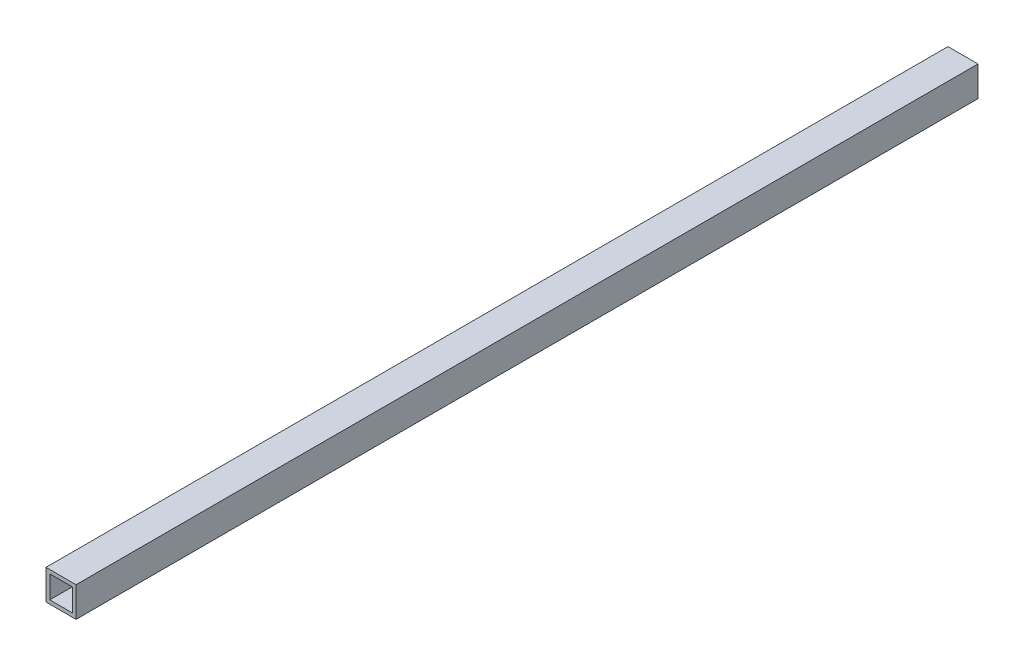
ISO-10303-21;
HEADER;
FILE_DESCRIPTION(('STEP AP214'),'2;1');
FILE_NAME('part.step','',(''),(''),'','','');
FILE_SCHEMA(('AUTOMOTIVE_DESIGN { 1 0 10303 214 1 1 1 1 }'));
ENDSEC;
DATA;
#1=APPLICATION_CONTEXT('core data for automotive mechanical design processes');
#2=APPLICATION_PROTOCOL_DEFINITION('international standard','automotive_design',2000,#1);
#3=PRODUCT_CONTEXT('',#1,'mechanical');
#4=PRODUCT('Part','Part','',(#3));
#5=PRODUCT_RELATED_PRODUCT_CATEGORY('part','',(#4));
#6=PRODUCT_DEFINITION_FORMATION('','',#4);
#7=PRODUCT_DEFINITION_CONTEXT('part definition',#1,'design');
#8=PRODUCT_DEFINITION('design','',#6,#7);
#9=PRODUCT_DEFINITION_SHAPE('','',#8);
#10=(LENGTH_UNIT() NAMED_UNIT(*) SI_UNIT(.MILLI.,.METRE.));
#11=(NAMED_UNIT(*) PLANE_ANGLE_UNIT() SI_UNIT($,.RADIAN.));
#12=(NAMED_UNIT(*) SI_UNIT($,.STERADIAN.) SOLID_ANGLE_UNIT());
#13=UNCERTAINTY_MEASURE_WITH_UNIT(LENGTH_MEASURE(1.E-05),#10,'distance_accuracy_value','');
#14=(GEOMETRIC_REPRESENTATION_CONTEXT(3) GLOBAL_UNCERTAINTY_ASSIGNED_CONTEXT((#13)) GLOBAL_UNIT_ASSIGNED_CONTEXT((#10,
#11,#12)) REPRESENTATION_CONTEXT('',''));
#15=CARTESIAN_POINT('',(0.,0.,0.));
#16=DIRECTION('',(0.,0.,1.));
#17=DIRECTION('',(1.,0.,0.));
#18=AXIS2_PLACEMENT_3D('',#15,#16,#17);
#19=CARTESIAN_POINT('',(0.,0.,762.));
#20=DIRECTION('',(0.,0.,-1.));
#21=DIRECTION('',(-1.,0.,0.));
#22=AXIS2_PLACEMENT_3D('',#19,#20,#21);
#23=PLANE('',#22);
#24=DIRECTION('',(0.,-1.,0.));
#25=VECTOR('',#24,1.);
#26=CARTESIAN_POINT('',(0.,0.,762.));
#27=LINE('',#26,#25);
#28=CARTESIAN_POINT('',(0.,25.4,762.));
#29=VERTEX_POINT('',#28);
#30=CARTESIAN_POINT('',(0.,0.,762.));
#31=VERTEX_POINT('',#30);
#32=EDGE_CURVE('E138',#29,#31,#27,.T.);
#33=ORIENTED_EDGE('',*,*,#32,.T.);
#34=DIRECTION('',(1.,0.,0.));
#35=VECTOR('',#34,1.);
#36=CARTESIAN_POINT('',(0.,0.,762.));
#37=LINE('',#36,#35);
#38=CARTESIAN_POINT('',(25.4,0.,762.));
#39=VERTEX_POINT('',#38);
#40=EDGE_CURVE('E141',#31,#39,#37,.T.);
#41=ORIENTED_EDGE('',*,*,#40,.T.);
#42=DIRECTION('',(0.,1.,0.));
#43=VECTOR('',#42,1.);
#44=CARTESIAN_POINT('',(25.4,0.,762.));
#45=LINE('',#44,#43);
#46=CARTESIAN_POINT('',(25.4,25.4,762.));
#47=VERTEX_POINT('',#46);
#48=EDGE_CURVE('E144',#39,#47,#45,.T.);
#49=ORIENTED_EDGE('',*,*,#48,.T.);
#50=DIRECTION('',(-1.,0.,0.));
#51=VECTOR('',#50,1.);
#52=CARTESIAN_POINT('',(0.,25.4,762.));
#53=LINE('',#52,#51);
#54=EDGE_CURVE('E146',#47,#29,#53,.T.);
#55=ORIENTED_EDGE('',*,*,#54,.T.);
#56=EDGE_LOOP('',(#33,#41,#49,#55));
#57=FACE_BOUND('',#56,.T.);
#58=DIRECTION('',(0.,-1.,0.));
#59=VECTOR('',#58,1.);
#60=CARTESIAN_POINT('',(3.175,3.175,762.));
#61=LINE('',#60,#59);
#62=CARTESIAN_POINT('',(3.175,22.225,762.));
#63=VERTEX_POINT('',#62);
#64=CARTESIAN_POINT('',(3.175,3.175,762.));
#65=VERTEX_POINT('',#64);
#66=EDGE_CURVE('E102',#63,#65,#61,.T.);
#67=ORIENTED_EDGE('',*,*,#66,.F.);
#68=DIRECTION('',(-1.,0.,0.));
#69=VECTOR('',#68,1.);
#70=CARTESIAN_POINT('',(3.175,22.225,762.));
#71=LINE('',#70,#69);
#72=CARTESIAN_POINT('',(22.225,22.225,762.));
#73=VERTEX_POINT('',#72);
#74=EDGE_CURVE('E124',#73,#63,#71,.T.);
#75=ORIENTED_EDGE('',*,*,#74,.F.);
#76=DIRECTION('',(0.,1.,0.));
#77=VECTOR('',#76,1.);
#78=CARTESIAN_POINT('',(22.225,3.175,762.));
#79=LINE('',#78,#77);
#80=CARTESIAN_POINT('',(22.225,3.175,762.));
#81=VERTEX_POINT('',#80);
#82=EDGE_CURVE('E122',#81,#73,#79,.T.);
#83=ORIENTED_EDGE('',*,*,#82,.F.);
#84=DIRECTION('',(1.,0.,0.));
#85=VECTOR('',#84,1.);
#86=CARTESIAN_POINT('',(3.175,3.175,762.));
#87=LINE('',#86,#85);
#88=EDGE_CURVE('E110',#65,#81,#87,.T.);
#89=ORIENTED_EDGE('',*,*,#88,.F.);
#90=EDGE_LOOP('',(#67,#75,#83,#89));
#91=FACE_BOUND('',#90,.T.);
#92=ADVANCED_FACE('F37',(#57,#91),#23,.F.);
#93=CARTESIAN_POINT('',(0.,0.,0.));
#94=DIRECTION('',(0.,0.,-1.));
#95=DIRECTION('',(-1.,0.,0.));
#96=AXIS2_PLACEMENT_3D('',#93,#94,#95);
#97=PLANE('',#96);
#98=DIRECTION('',(0.,-1.,0.));
#99=VECTOR('',#98,1.);
#100=CARTESIAN_POINT('',(0.,0.,0.));
#101=LINE('',#100,#99);
#102=CARTESIAN_POINT('',(0.,25.4,0.));
#103=VERTEX_POINT('',#102);
#104=CARTESIAN_POINT('',(0.,0.,0.));
#105=VERTEX_POINT('',#104);
#106=EDGE_CURVE('E118',#103,#105,#101,.T.);
#107=ORIENTED_EDGE('',*,*,#106,.F.);
#108=DIRECTION('',(-1.,0.,0.));
#109=VECTOR('',#108,1.);
#110=CARTESIAN_POINT('',(0.,25.4,0.));
#111=LINE('',#110,#109);
#112=CARTESIAN_POINT('',(25.4,25.4,0.));
#113=VERTEX_POINT('',#112);
#114=EDGE_CURVE('E142',#113,#103,#111,.T.);
#115=ORIENTED_EDGE('',*,*,#114,.F.);
#116=DIRECTION('',(0.,1.,0.));
#117=VECTOR('',#116,1.);
#118=CARTESIAN_POINT('',(25.4,0.,0.));
#119=LINE('',#118,#117);
#120=CARTESIAN_POINT('',(25.4,0.,0.));
#121=VERTEX_POINT('',#120);
#122=EDGE_CURVE('E153',#121,#113,#119,.T.);
#123=ORIENTED_EDGE('',*,*,#122,.F.);
#124=DIRECTION('',(1.,0.,0.));
#125=VECTOR('',#124,1.);
#126=CARTESIAN_POINT('',(0.,0.,0.));
#127=LINE('',#126,#125);
#128=EDGE_CURVE('E151',#105,#121,#127,.T.);
#129=ORIENTED_EDGE('',*,*,#128,.F.);
#130=EDGE_LOOP('',(#107,#115,#123,#129));
#131=FACE_BOUND('',#130,.T.);
#132=DIRECTION('',(-1.,0.,0.));
#133=VECTOR('',#132,1.);
#134=CARTESIAN_POINT('',(3.175,22.225,0.));
#135=LINE('',#134,#133);
#136=CARTESIAN_POINT('',(22.225,22.225,0.));
#137=VERTEX_POINT('',#136);
#138=CARTESIAN_POINT('',(3.175,22.225,0.));
#139=VERTEX_POINT('',#138);
#140=EDGE_CURVE('E111',#137,#139,#135,.T.);
#141=ORIENTED_EDGE('',*,*,#140,.T.);
#142=DIRECTION('',(0.,-1.,0.));
#143=VECTOR('',#142,1.);
#144=CARTESIAN_POINT('',(3.175,3.175,0.));
#145=LINE('',#144,#143);
#146=CARTESIAN_POINT('',(3.175,3.175,0.));
#147=VERTEX_POINT('',#146);
#148=EDGE_CURVE('E60',#139,#147,#145,.T.);
#149=ORIENTED_EDGE('',*,*,#148,.T.);
#150=DIRECTION('',(1.,0.,0.));
#151=VECTOR('',#150,1.);
#152=CARTESIAN_POINT('',(3.175,3.175,0.));
#153=LINE('',#152,#151);
#154=CARTESIAN_POINT('',(22.225,3.175,0.));
#155=VERTEX_POINT('',#154);
#156=EDGE_CURVE('E117',#147,#155,#153,.T.);
#157=ORIENTED_EDGE('',*,*,#156,.T.);
#158=DIRECTION('',(0.,1.,0.));
#159=VECTOR('',#158,1.);
#160=CARTESIAN_POINT('',(22.225,3.175,0.));
#161=LINE('',#160,#159);
#162=EDGE_CURVE('E130',#155,#137,#161,.T.);
#163=ORIENTED_EDGE('',*,*,#162,.T.);
#164=EDGE_LOOP('',(#141,#149,#157,#163));
#165=FACE_BOUND('',#164,.T.);
#166=ADVANCED_FACE('F171',(#131,#165),#97,.T.);
#167=CARTESIAN_POINT('',(0.,0.,762.));
#168=DIRECTION('',(1.,0.,0.));
#169=DIRECTION('',(0.,1.,0.));
#170=AXIS2_PLACEMENT_3D('',#167,#168,#169);
#171=PLANE('',#170);
#172=ORIENTED_EDGE('',*,*,#106,.T.);
#173=DIRECTION('',(0.,0.,-1.));
#174=VECTOR('',#173,1.);
#175=CARTESIAN_POINT('',(0.,0.,762.));
#176=LINE('',#175,#174);
#177=EDGE_CURVE('E11',#31,#105,#176,.T.);
#178=ORIENTED_EDGE('',*,*,#177,.F.);
#179=ORIENTED_EDGE('',*,*,#32,.F.);
#180=DIRECTION('',(0.,0.,-1.));
#181=VECTOR('',#180,1.);
#182=CARTESIAN_POINT('',(0.,25.4,762.));
#183=LINE('',#182,#181);
#184=EDGE_CURVE('E148',#29,#103,#183,.T.);
#185=ORIENTED_EDGE('',*,*,#184,.T.);
#186=EDGE_LOOP('',(#172,#178,#179,#185));
#187=FACE_BOUND('',#186,.T.);
#188=ADVANCED_FACE('F39',(#187),#171,.F.);
#189=CARTESIAN_POINT('',(0.,0.,762.));
#190=DIRECTION('',(0.,1.,0.));
#191=DIRECTION('',(0.,0.,1.));
#192=AXIS2_PLACEMENT_3D('',#189,#190,#191);
#193=PLANE('',#192);
#194=ORIENTED_EDGE('',*,*,#128,.T.);
#195=DIRECTION('',(0.,0.,-1.));
#196=VECTOR('',#195,1.);
#197=CARTESIAN_POINT('',(25.4,0.,762.));
#198=LINE('',#197,#196);
#199=EDGE_CURVE('E45',#39,#121,#198,.T.);
#200=ORIENTED_EDGE('',*,*,#199,.F.);
#201=ORIENTED_EDGE('',*,*,#40,.F.);
#202=ORIENTED_EDGE('',*,*,#177,.T.);
#203=EDGE_LOOP('',(#194,#200,#201,#202));
#204=FACE_BOUND('',#203,.T.);
#205=ADVANCED_FACE('F181',(#204),#193,.F.);
#206=CARTESIAN_POINT('',(25.4,0.,762.));
#207=DIRECTION('',(-1.,0.,0.));
#208=DIRECTION('',(0.,-1.,0.));
#209=AXIS2_PLACEMENT_3D('',#206,#207,#208);
#210=PLANE('',#209);
#211=ORIENTED_EDGE('',*,*,#122,.T.);
#212=DIRECTION('',(0.,0.,-1.));
#213=VECTOR('',#212,1.);
#214=CARTESIAN_POINT('',(25.4,25.4,762.));
#215=LINE('',#214,#213);
#216=EDGE_CURVE('E158',#47,#113,#215,.T.);
#217=ORIENTED_EDGE('',*,*,#216,.F.);
#218=ORIENTED_EDGE('',*,*,#48,.F.);
#219=ORIENTED_EDGE('',*,*,#199,.T.);
#220=EDGE_LOOP('',(#211,#217,#218,#219));
#221=FACE_BOUND('',#220,.T.);
#222=ADVANCED_FACE('F165',(#221),#210,.F.);
#223=CARTESIAN_POINT('',(0.,25.4,762.));
#224=DIRECTION('',(0.,-1.,0.));
#225=DIRECTION('',(0.,0.,-1.));
#226=AXIS2_PLACEMENT_3D('',#223,#224,#225);
#227=PLANE('',#226);
#228=ORIENTED_EDGE('',*,*,#114,.T.);
#229=ORIENTED_EDGE('',*,*,#184,.F.);
#230=ORIENTED_EDGE('',*,*,#54,.F.);
#231=ORIENTED_EDGE('',*,*,#216,.T.);
#232=EDGE_LOOP('',(#228,#229,#230,#231));
#233=FACE_BOUND('',#232,.T.);
#234=ADVANCED_FACE('F175',(#233),#227,.F.);
#235=CARTESIAN_POINT('',(3.175,3.175,762.));
#236=DIRECTION('',(1.,0.,0.));
#237=DIRECTION('',(0.,0.,-1.));
#238=AXIS2_PLACEMENT_3D('',#235,#236,#237);
#239=PLANE('',#238);
#240=ORIENTED_EDGE('',*,*,#148,.F.);
#241=DIRECTION('',(0.,0.,-1.));
#242=VECTOR('',#241,1.);
#243=CARTESIAN_POINT('',(3.175,22.225,762.));
#244=LINE('',#243,#242);
#245=EDGE_CURVE('E106',#63,#139,#244,.T.);
#246=ORIENTED_EDGE('',*,*,#245,.F.);
#247=ORIENTED_EDGE('',*,*,#66,.T.);
#248=DIRECTION('',(0.,0.,-1.));
#249=VECTOR('',#248,1.);
#250=CARTESIAN_POINT('',(3.175,3.175,762.));
#251=LINE('',#250,#249);
#252=EDGE_CURVE('E105',#65,#147,#251,.T.);
#253=ORIENTED_EDGE('',*,*,#252,.T.);
#254=EDGE_LOOP('',(#240,#246,#247,#253));
#255=FACE_BOUND('',#254,.T.);
#256=ADVANCED_FACE('F104',(#255),#239,.T.);
#257=CARTESIAN_POINT('',(3.175,3.175,762.));
#258=DIRECTION('',(0.,1.,0.));
#259=DIRECTION('',(0.,0.,1.));
#260=AXIS2_PLACEMENT_3D('',#257,#258,#259);
#261=PLANE('',#260);
#262=ORIENTED_EDGE('',*,*,#156,.F.);
#263=ORIENTED_EDGE('',*,*,#252,.F.);
#264=ORIENTED_EDGE('',*,*,#88,.T.);
#265=DIRECTION('',(0.,0.,-1.));
#266=VECTOR('',#265,1.);
#267=CARTESIAN_POINT('',(22.225,3.175,762.));
#268=LINE('',#267,#266);
#269=EDGE_CURVE('E119',#81,#155,#268,.T.);
#270=ORIENTED_EDGE('',*,*,#269,.T.);
#271=EDGE_LOOP('',(#262,#263,#264,#270));
#272=FACE_BOUND('',#271,.T.);
#273=ADVANCED_FACE('F114',(#272),#261,.T.);
#274=CARTESIAN_POINT('',(22.225,3.175,762.));
#275=DIRECTION('',(-1.,0.,0.));
#276=DIRECTION('',(0.,0.,1.));
#277=AXIS2_PLACEMENT_3D('',#274,#275,#276);
#278=PLANE('',#277);
#279=ORIENTED_EDGE('',*,*,#162,.F.);
#280=ORIENTED_EDGE('',*,*,#269,.F.);
#281=ORIENTED_EDGE('',*,*,#82,.T.);
#282=DIRECTION('',(0.,0.,-1.));
#283=VECTOR('',#282,1.);
#284=CARTESIAN_POINT('',(22.225,22.225,762.));
#285=LINE('',#284,#283);
#286=EDGE_CURVE('E52',#73,#137,#285,.T.);
#287=ORIENTED_EDGE('',*,*,#286,.T.);
#288=EDGE_LOOP('',(#279,#280,#281,#287));
#289=FACE_BOUND('',#288,.T.);
#290=ADVANCED_FACE('F204',(#289),#278,.T.);
#291=CARTESIAN_POINT('',(3.175,22.225,762.));
#292=DIRECTION('',(0.,-1.,0.));
#293=DIRECTION('',(0.,0.,-1.));
#294=AXIS2_PLACEMENT_3D('',#291,#292,#293);
#295=PLANE('',#294);
#296=ORIENTED_EDGE('',*,*,#140,.F.);
#297=ORIENTED_EDGE('',*,*,#286,.F.);
#298=ORIENTED_EDGE('',*,*,#74,.T.);
#299=ORIENTED_EDGE('',*,*,#245,.T.);
#300=EDGE_LOOP('',(#296,#297,#298,#299));
#301=FACE_BOUND('',#300,.T.);
#302=ADVANCED_FACE('F208',(#301),#295,.T.);
#303=CLOSED_SHELL('',(#92,#166,#188,#205,#222,#234,#256,#273,#290,#302));
#304=MANIFOLD_SOLID_BREP('B2',#303);
#305=ADVANCED_BREP_SHAPE_REPRESENTATION('',(#18,#304),#14);
#306=SHAPE_DEFINITION_REPRESENTATION(#9,#305);
ENDSEC;
END-ISO-10303-21;
